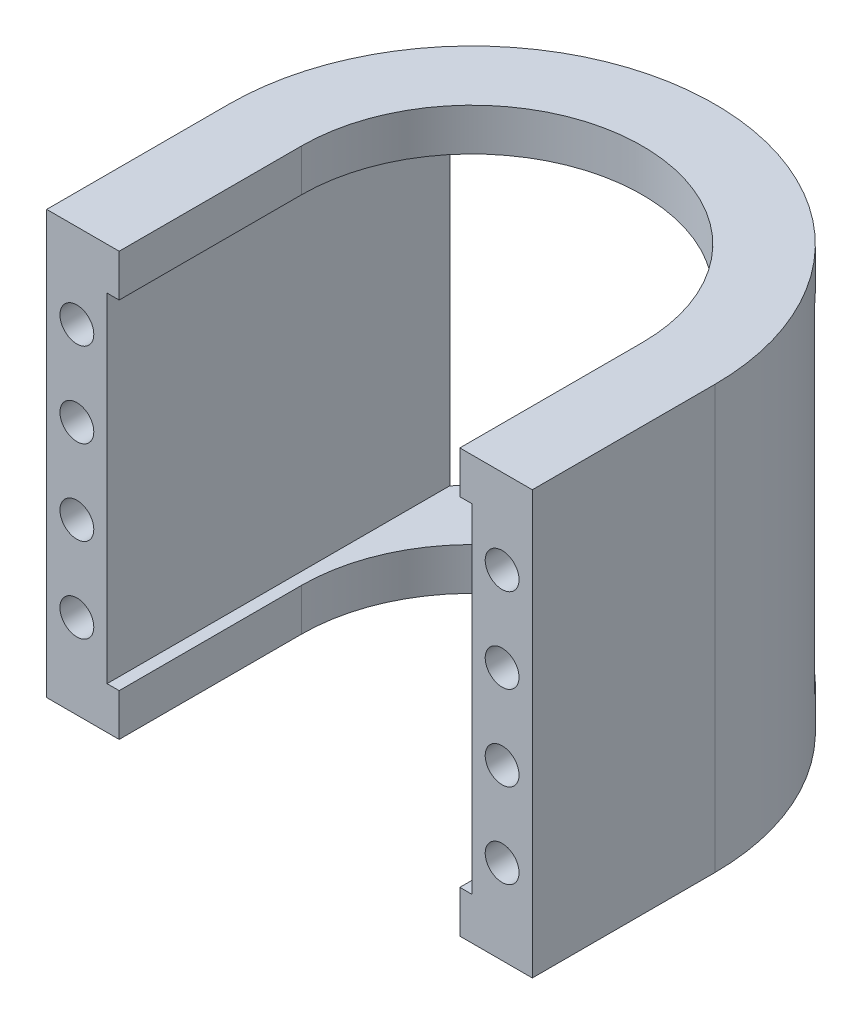
ISO-10303-21;
HEADER;
FILE_DESCRIPTION(('STEP AP214'),'2;1');
FILE_NAME('part.step','',(''),(''),'','','');
FILE_SCHEMA(('AUTOMOTIVE_DESIGN { 1 0 10303 214 1 1 1 1 }'));
ENDSEC;
DATA;
#1=APPLICATION_CONTEXT('core data for automotive mechanical design processes');
#2=APPLICATION_PROTOCOL_DEFINITION('international standard','automotive_design',2000,#1);
#3=PRODUCT_CONTEXT('',#1,'mechanical');
#4=PRODUCT('Part','Part','',(#3));
#5=PRODUCT_RELATED_PRODUCT_CATEGORY('part','',(#4));
#6=PRODUCT_DEFINITION_FORMATION('','',#4);
#7=PRODUCT_DEFINITION_CONTEXT('part definition',#1,'design');
#8=PRODUCT_DEFINITION('design','',#6,#7);
#9=PRODUCT_DEFINITION_SHAPE('','',#8);
#10=(LENGTH_UNIT() NAMED_UNIT(*) SI_UNIT(.MILLI.,.METRE.));
#11=(NAMED_UNIT(*) PLANE_ANGLE_UNIT() SI_UNIT($,.RADIAN.));
#12=(NAMED_UNIT(*) SI_UNIT($,.STERADIAN.) SOLID_ANGLE_UNIT());
#13=UNCERTAINTY_MEASURE_WITH_UNIT(LENGTH_MEASURE(1.E-05),#10,'distance_accuracy_value','');
#14=(GEOMETRIC_REPRESENTATION_CONTEXT(3) GLOBAL_UNCERTAINTY_ASSIGNED_CONTEXT((#13)) GLOBAL_UNIT_ASSIGNED_CONTEXT((#10,
#11,#12)) REPRESENTATION_CONTEXT('',''));
#15=CARTESIAN_POINT('',(0.,0.,0.));
#16=DIRECTION('',(0.,0.,1.));
#17=DIRECTION('',(1.,0.,0.));
#18=AXIS2_PLACEMENT_3D('',#15,#16,#17);
#19=CARTESIAN_POINT('',(-15.1,35.,0.));
#20=DIRECTION('',(-1.,0.,0.));
#21=DIRECTION('',(0.,0.,1.));
#22=AXIS2_PLACEMENT_3D('',#19,#20,#21);
#23=PLANE('',#22);
#24=DIRECTION('',(0.,-1.,0.));
#25=VECTOR('',#24,1.);
#26=CARTESIAN_POINT('',(-15.1,35.,15.1));
#27=LINE('',#26,#25);
#28=CARTESIAN_POINT('',(-15.1,31.5,15.1));
#29=VERTEX_POINT('',#28);
#30=CARTESIAN_POINT('',(-15.1,3.5,15.1));
#31=VERTEX_POINT('',#30);
#32=EDGE_CURVE('E261',#29,#31,#27,.T.);
#33=ORIENTED_EDGE('',*,*,#32,.T.);
#34=DIRECTION('',(0.,0.,1.));
#35=VECTOR('',#34,1.);
#36=CARTESIAN_POINT('',(-15.1,3.5,-20.1));
#37=LINE('',#36,#35);
#38=CARTESIAN_POINT('',(-15.1,3.5,-13.2664991614216));
#39=VERTEX_POINT('',#38);
#40=EDGE_CURVE('E50',#39,#31,#37,.T.);
#41=ORIENTED_EDGE('',*,*,#40,.F.);
#42=DIRECTION('',(0.,-1.,0.));
#43=VECTOR('',#42,1.);
#44=CARTESIAN_POINT('',(-15.1,35.,-13.2664991614216));
#45=LINE('',#44,#43);
#46=CARTESIAN_POINT('',(-15.1,31.5,-13.2664991614216));
#47=VERTEX_POINT('',#46);
#48=EDGE_CURVE('E43',#47,#39,#45,.T.);
#49=ORIENTED_EDGE('',*,*,#48,.F.);
#50=DIRECTION('',(0.,0.,1.));
#51=VECTOR('',#50,1.);
#52=CARTESIAN_POINT('',(-15.1,31.5,-20.1));
#53=LINE('',#52,#51);
#54=EDGE_CURVE('E227',#47,#29,#53,.T.);
#55=ORIENTED_EDGE('',*,*,#54,.T.);
#56=EDGE_LOOP('',(#33,#41,#49,#55));
#57=FACE_BOUND('',#56,.T.);
#58=ADVANCED_FACE('F35',(#57),#23,.F.);
#59=CARTESIAN_POINT('',(15.1,35.,0.));
#60=DIRECTION('',(1.,0.,0.));
#61=DIRECTION('',(0.,0.,-1.));
#62=AXIS2_PLACEMENT_3D('',#59,#60,#61);
#63=PLANE('',#62);
#64=DIRECTION('',(0.,0.,1.));
#65=VECTOR('',#64,1.);
#66=CARTESIAN_POINT('',(15.1,3.5,-20.1));
#67=LINE('',#66,#65);
#68=CARTESIAN_POINT('',(15.1,3.5,-13.2664991614216));
#69=VERTEX_POINT('',#68);
#70=CARTESIAN_POINT('',(15.1,3.5,15.1));
#71=VERTEX_POINT('',#70);
#72=EDGE_CURVE('E58',#69,#71,#67,.T.);
#73=ORIENTED_EDGE('',*,*,#72,.T.);
#74=DIRECTION('',(0.,-1.,0.));
#75=VECTOR('',#74,1.);
#76=CARTESIAN_POINT('',(15.1,35.,15.1));
#77=LINE('',#76,#75);
#78=CARTESIAN_POINT('',(15.1,31.5,15.1));
#79=VERTEX_POINT('',#78);
#80=EDGE_CURVE('E259',#79,#71,#77,.T.);
#81=ORIENTED_EDGE('',*,*,#80,.F.);
#82=DIRECTION('',(0.,0.,1.));
#83=VECTOR('',#82,1.);
#84=CARTESIAN_POINT('',(15.1,31.5,-20.1));
#85=LINE('',#84,#83);
#86=CARTESIAN_POINT('',(15.1,31.5,-13.2664991614216));
#87=VERTEX_POINT('',#86);
#88=EDGE_CURVE('E230',#87,#79,#85,.T.);
#89=ORIENTED_EDGE('',*,*,#88,.F.);
#90=DIRECTION('',(0.,-1.,0.));
#91=VECTOR('',#90,1.);
#92=CARTESIAN_POINT('',(15.1,35.,-13.2664991614216));
#93=LINE('',#92,#91);
#94=EDGE_CURVE('E11',#69,#87,#93,.F.);
#95=ORIENTED_EDGE('',*,*,#94,.F.);
#96=EDGE_LOOP('',(#73,#81,#89,#95));
#97=FACE_BOUND('',#96,.T.);
#98=ADVANCED_FACE('F384',(#97),#63,.F.);
#99=CARTESIAN_POINT('',(-20.1,35.,0.));
#100=DIRECTION('',(1.,0.,0.));
#101=DIRECTION('',(0.,0.,-1.));
#102=AXIS2_PLACEMENT_3D('',#99,#100,#101);
#103=PLANE('',#102);
#104=DIRECTION('',(0.,0.,1.));
#105=VECTOR('',#104,1.);
#106=CARTESIAN_POINT('',(-20.1,0.,0.));
#107=LINE('',#106,#105);
#108=CARTESIAN_POINT('',(-20.1,0.,0.));
#109=VERTEX_POINT('',#108);
#110=CARTESIAN_POINT('',(-20.1,0.,15.1));
#111=VERTEX_POINT('',#110);
#112=EDGE_CURVE('E229',#109,#111,#107,.T.);
#113=ORIENTED_EDGE('',*,*,#112,.T.);
#114=DIRECTION('',(0.,-1.,0.));
#115=VECTOR('',#114,1.);
#116=CARTESIAN_POINT('',(-20.1,35.,15.1));
#117=LINE('',#116,#115);
#118=CARTESIAN_POINT('',(-20.1,35.,15.1));
#119=VERTEX_POINT('',#118);
#120=EDGE_CURVE('E263',#119,#111,#117,.T.);
#121=ORIENTED_EDGE('',*,*,#120,.F.);
#122=DIRECTION('',(0.,0.,1.));
#123=VECTOR('',#122,1.);
#124=CARTESIAN_POINT('',(-20.1,35.,0.));
#125=LINE('',#124,#123);
#126=CARTESIAN_POINT('',(-20.1,35.,0.));
#127=VERTEX_POINT('',#126);
#128=EDGE_CURVE('E234',#127,#119,#125,.T.);
#129=ORIENTED_EDGE('',*,*,#128,.F.);
#130=DIRECTION('',(0.,-1.,0.));
#131=VECTOR('',#130,1.);
#132=CARTESIAN_POINT('',(-20.1,35.,0.));
#133=LINE('',#132,#131);
#134=EDGE_CURVE('E246',#127,#109,#133,.T.);
#135=ORIENTED_EDGE('',*,*,#134,.T.);
#136=EDGE_LOOP('',(#113,#121,#129,#135));
#137=FACE_BOUND('',#136,.T.);
#138=ADVANCED_FACE('F37',(#137),#103,.F.);
#139=CARTESIAN_POINT('',(-15.1,35.,15.1));
#140=DIRECTION('',(0.,0.,-1.));
#141=DIRECTION('',(-1.,0.,0.));
#142=AXIS2_PLACEMENT_3D('',#139,#140,#141);
#143=PLANE('',#142);
#144=CARTESIAN_POINT('',(-17.5999999999998,7.,15.1));
#145=DIRECTION('',(0.,0.,1.));
#146=DIRECTION('',(1.,0.,0.));
#147=AXIS2_PLACEMENT_3D('',#144,#145,#146);
#148=CIRCLE('',#147,1.4);
#149=CARTESIAN_POINT('',(-16.1999999999998,7.,15.1));
#150=VERTEX_POINT('',#149);
#151=EDGE_CURVE('E318',#150,#150,#148,.T.);
#152=ORIENTED_EDGE('',*,*,#151,.F.);
#153=EDGE_LOOP('',(#152));
#154=FACE_BOUND('',#153,.T.);
#155=CARTESIAN_POINT('',(-17.5999999999998,14.,15.1));
#156=DIRECTION('',(0.,0.,1.));
#157=DIRECTION('',(1.,0.,0.));
#158=AXIS2_PLACEMENT_3D('',#155,#156,#157);
#159=CIRCLE('',#158,1.4);
#160=CARTESIAN_POINT('',(-16.1999999999998,14.,15.1));
#161=VERTEX_POINT('',#160);
#162=EDGE_CURVE('E317',#161,#161,#159,.T.);
#163=ORIENTED_EDGE('',*,*,#162,.F.);
#164=EDGE_LOOP('',(#163));
#165=FACE_BOUND('',#164,.T.);
#166=CARTESIAN_POINT('',(-17.5999999999999,21.,15.1));
#167=DIRECTION('',(0.,0.,1.));
#168=DIRECTION('',(1.,0.,0.));
#169=AXIS2_PLACEMENT_3D('',#166,#167,#168);
#170=CIRCLE('',#169,1.4);
#171=CARTESIAN_POINT('',(-16.1999999999999,21.,15.1));
#172=VERTEX_POINT('',#171);
#173=EDGE_CURVE('E312',#172,#172,#170,.T.);
#174=ORIENTED_EDGE('',*,*,#173,.F.);
#175=EDGE_LOOP('',(#174));
#176=FACE_BOUND('',#175,.T.);
#177=CARTESIAN_POINT('',(-17.6,28.,15.1));
#178=DIRECTION('',(0.,0.,1.));
#179=DIRECTION('',(1.,0.,0.));
#180=AXIS2_PLACEMENT_3D('',#177,#178,#179);
#181=CIRCLE('',#180,1.4);
#182=CARTESIAN_POINT('',(-16.2,28.,15.1));
#183=VERTEX_POINT('',#182);
#184=EDGE_CURVE('E183',#183,#183,#181,.T.);
#185=ORIENTED_EDGE('',*,*,#184,.F.);
#186=EDGE_LOOP('',(#185));
#187=FACE_BOUND('',#186,.T.);
#188=DIRECTION('',(1.,0.,0.));
#189=VECTOR('',#188,1.);
#190=CARTESIAN_POINT('',(-15.1,0.,15.1));
#191=LINE('',#190,#189);
#192=CARTESIAN_POINT('',(-14.1,0.,15.1));
#193=VERTEX_POINT('',#192);
#194=EDGE_CURVE('E162',#111,#193,#191,.T.);
#195=ORIENTED_EDGE('',*,*,#194,.T.);
#196=DIRECTION('',(0.,-1.,0.));
#197=VECTOR('',#196,1.);
#198=CARTESIAN_POINT('',(-14.1,46.2092495836675,15.1));
#199=LINE('',#198,#197);
#200=CARTESIAN_POINT('',(-14.1,3.5,15.1));
#201=VERTEX_POINT('',#200);
#202=EDGE_CURVE('E191',#201,#193,#199,.T.);
#203=ORIENTED_EDGE('',*,*,#202,.F.);
#204=DIRECTION('',(1.,0.,0.));
#205=VECTOR('',#204,1.);
#206=CARTESIAN_POINT('',(-15.1,3.5,15.1));
#207=LINE('',#206,#205);
#208=EDGE_CURVE('E186',#31,#201,#207,.T.);
#209=ORIENTED_EDGE('',*,*,#208,.F.);
#210=ORIENTED_EDGE('',*,*,#32,.F.);
#211=DIRECTION('',(-1.,0.,0.));
#212=VECTOR('',#211,1.);
#213=CARTESIAN_POINT('',(-14.1,31.5,15.1));
#214=LINE('',#213,#212);
#215=CARTESIAN_POINT('',(-14.1,31.5,15.1));
#216=VERTEX_POINT('',#215);
#217=EDGE_CURVE('E197',#216,#29,#214,.T.);
#218=ORIENTED_EDGE('',*,*,#217,.F.);
#219=DIRECTION('',(0.,1.,0.));
#220=VECTOR('',#219,1.);
#221=CARTESIAN_POINT('',(-14.1,-11.2092495836675,15.1));
#222=LINE('',#221,#220);
#223=CARTESIAN_POINT('',(-14.1,35.,15.1));
#224=VERTEX_POINT('',#223);
#225=EDGE_CURVE('E218',#216,#224,#222,.T.);
#226=ORIENTED_EDGE('',*,*,#225,.T.);
#227=DIRECTION('',(1.,0.,0.));
#228=VECTOR('',#227,1.);
#229=CARTESIAN_POINT('',(-15.1,35.,15.1));
#230=LINE('',#229,#228);
#231=EDGE_CURVE('E237',#119,#224,#230,.T.);
#232=ORIENTED_EDGE('',*,*,#231,.F.);
#233=ORIENTED_EDGE('',*,*,#120,.T.);
#234=EDGE_LOOP('',(#195,#203,#209,#210,#218,#226,#232,#233));
#235=FACE_BOUND('',#234,.T.);
#236=ADVANCED_FACE('F284',(#154,#165,#176,#187,#235),#143,.F.);
#237=CARTESIAN_POINT('',(15.1,35.,15.1));
#238=DIRECTION('',(0.,0.,-1.));
#239=DIRECTION('',(-1.,0.,0.));
#240=AXIS2_PLACEMENT_3D('',#237,#238,#239);
#241=PLANE('',#240);
#242=CARTESIAN_POINT('',(17.6,28.,15.1));
#243=DIRECTION('',(0.,0.,1.));
#244=DIRECTION('',(1.,0.,0.));
#245=AXIS2_PLACEMENT_3D('',#242,#243,#244);
#246=CIRCLE('',#245,1.4);
#247=CARTESIAN_POINT('',(19.,28.,15.1));
#248=VERTEX_POINT('',#247);
#249=EDGE_CURVE('E329',#248,#248,#246,.T.);
#250=ORIENTED_EDGE('',*,*,#249,.F.);
#251=EDGE_LOOP('',(#250));
#252=FACE_BOUND('',#251,.T.);
#253=CARTESIAN_POINT('',(17.6000000000001,21.,15.1));
#254=DIRECTION('',(0.,0.,1.));
#255=DIRECTION('',(1.,0.,0.));
#256=AXIS2_PLACEMENT_3D('',#253,#254,#255);
#257=CIRCLE('',#256,1.4);
#258=CARTESIAN_POINT('',(19.0000000000001,21.,15.1));
#259=VERTEX_POINT('',#258);
#260=EDGE_CURVE('E330',#259,#259,#257,.T.);
#261=ORIENTED_EDGE('',*,*,#260,.F.);
#262=EDGE_LOOP('',(#261));
#263=FACE_BOUND('',#262,.T.);
#264=CARTESIAN_POINT('',(17.6000000000002,14.,15.1));
#265=DIRECTION('',(0.,0.,1.));
#266=DIRECTION('',(1.,0.,0.));
#267=AXIS2_PLACEMENT_3D('',#264,#265,#266);
#268=CIRCLE('',#267,1.4);
#269=CARTESIAN_POINT('',(19.0000000000002,14.,15.1));
#270=VERTEX_POINT('',#269);
#271=EDGE_CURVE('E347',#270,#270,#268,.T.);
#272=ORIENTED_EDGE('',*,*,#271,.F.);
#273=EDGE_LOOP('',(#272));
#274=FACE_BOUND('',#273,.T.);
#275=CARTESIAN_POINT('',(17.6000000000002,7.,15.1));
#276=DIRECTION('',(0.,0.,1.));
#277=DIRECTION('',(1.,0.,0.));
#278=AXIS2_PLACEMENT_3D('',#275,#276,#277);
#279=CIRCLE('',#278,1.4);
#280=CARTESIAN_POINT('',(19.0000000000002,7.,15.1));
#281=VERTEX_POINT('',#280);
#282=EDGE_CURVE('E341',#281,#281,#279,.T.);
#283=ORIENTED_EDGE('',*,*,#282,.F.);
#284=EDGE_LOOP('',(#283));
#285=FACE_BOUND('',#284,.T.);
#286=DIRECTION('',(1.,0.,0.));
#287=VECTOR('',#286,1.);
#288=CARTESIAN_POINT('',(15.1,0.,15.1));
#289=LINE('',#288,#287);
#290=CARTESIAN_POINT('',(14.1,0.,15.1));
#291=VERTEX_POINT('',#290);
#292=CARTESIAN_POINT('',(20.1,0.,15.1));
#293=VERTEX_POINT('',#292);
#294=EDGE_CURVE('E150',#291,#293,#289,.T.);
#295=ORIENTED_EDGE('',*,*,#294,.T.);
#296=DIRECTION('',(0.,-1.,0.));
#297=VECTOR('',#296,1.);
#298=CARTESIAN_POINT('',(20.1,35.,15.1));
#299=LINE('',#298,#297);
#300=CARTESIAN_POINT('',(20.1,35.,15.1));
#301=VERTEX_POINT('',#300);
#302=EDGE_CURVE('E257',#301,#293,#299,.T.);
#303=ORIENTED_EDGE('',*,*,#302,.F.);
#304=DIRECTION('',(1.,0.,0.));
#305=VECTOR('',#304,1.);
#306=CARTESIAN_POINT('',(15.1,35.,15.1));
#307=LINE('',#306,#305);
#308=CARTESIAN_POINT('',(14.1,35.,15.1));
#309=VERTEX_POINT('',#308);
#310=EDGE_CURVE('E240',#309,#301,#307,.T.);
#311=ORIENTED_EDGE('',*,*,#310,.F.);
#312=DIRECTION('',(0.,1.,0.));
#313=VECTOR('',#312,1.);
#314=CARTESIAN_POINT('',(14.1,-11.2092495836675,15.1));
#315=LINE('',#314,#313);
#316=CARTESIAN_POINT('',(14.1,31.5,15.1));
#317=VERTEX_POINT('',#316);
#318=EDGE_CURVE('E201',#317,#309,#315,.T.);
#319=ORIENTED_EDGE('',*,*,#318,.F.);
#320=DIRECTION('',(-1.,0.,0.));
#321=VECTOR('',#320,1.);
#322=CARTESIAN_POINT('',(14.1,31.5,15.1));
#323=LINE('',#322,#321);
#324=EDGE_CURVE('E207',#79,#317,#323,.T.);
#325=ORIENTED_EDGE('',*,*,#324,.F.);
#326=ORIENTED_EDGE('',*,*,#80,.T.);
#327=DIRECTION('',(1.,0.,0.));
#328=VECTOR('',#327,1.);
#329=CARTESIAN_POINT('',(14.1,3.5,15.1));
#330=LINE('',#329,#328);
#331=CARTESIAN_POINT('',(14.1,3.5,15.1));
#332=VERTEX_POINT('',#331);
#333=EDGE_CURVE('E169',#332,#71,#330,.T.);
#334=ORIENTED_EDGE('',*,*,#333,.F.);
#335=DIRECTION('',(0.,-1.,0.));
#336=VECTOR('',#335,1.);
#337=CARTESIAN_POINT('',(14.1,46.2092495836675,15.1));
#338=LINE('',#337,#336);
#339=EDGE_CURVE('E166',#332,#291,#338,.T.);
#340=ORIENTED_EDGE('',*,*,#339,.T.);
#341=EDGE_LOOP('',(#295,#303,#311,#319,#325,#326,#334,#340));
#342=FACE_BOUND('',#341,.T.);
#343=ADVANCED_FACE('F167',(#252,#263,#274,#285,#342),#241,.F.);
#344=CARTESIAN_POINT('',(20.1,35.,0.));
#345=DIRECTION('',(-1.,0.,0.));
#346=DIRECTION('',(0.,0.,1.));
#347=AXIS2_PLACEMENT_3D('',#344,#345,#346);
#348=PLANE('',#347);
#349=DIRECTION('',(0.,0.,-1.));
#350=VECTOR('',#349,1.);
#351=CARTESIAN_POINT('',(20.1,0.,0.));
#352=LINE('',#351,#350);
#353=CARTESIAN_POINT('',(20.1,0.,0.));
#354=VERTEX_POINT('',#353);
#355=EDGE_CURVE('E158',#293,#354,#352,.T.);
#356=ORIENTED_EDGE('',*,*,#355,.T.);
#357=DIRECTION('',(0.,-1.,0.));
#358=VECTOR('',#357,1.);
#359=CARTESIAN_POINT('',(20.1,35.,0.));
#360=LINE('',#359,#358);
#361=CARTESIAN_POINT('',(20.1,35.,0.));
#362=VERTEX_POINT('',#361);
#363=EDGE_CURVE('E254',#362,#354,#360,.T.);
#364=ORIENTED_EDGE('',*,*,#363,.F.);
#365=DIRECTION('',(0.,0.,-1.));
#366=VECTOR('',#365,1.);
#367=CARTESIAN_POINT('',(20.1,35.,0.));
#368=LINE('',#367,#366);
#369=EDGE_CURVE('E242',#301,#362,#368,.T.);
#370=ORIENTED_EDGE('',*,*,#369,.F.);
#371=ORIENTED_EDGE('',*,*,#302,.T.);
#372=EDGE_LOOP('',(#356,#364,#370,#371));
#373=FACE_BOUND('',#372,.T.);
#374=ADVANCED_FACE('F360',(#373),#348,.F.);
#375=CARTESIAN_POINT('',(0.,35.,0.));
#376=DIRECTION('',(0.,-1.,0.));
#377=DIRECTION('',(0.,0.,-1.));
#378=AXIS2_PLACEMENT_3D('',#375,#376,#377);
#379=CYLINDRICAL_SURFACE('',#378,20.1);
#380=ORIENTED_EDGE('',*,*,#94,.T.);
#381=CARTESIAN_POINT('',(0.,31.5,0.));
#382=DIRECTION('',(0.,1.,0.));
#383=DIRECTION('',(0.,0.,1.));
#384=AXIS2_PLACEMENT_3D('',#381,#382,#383);
#385=CIRCLE('',#384,20.1);
#386=EDGE_CURVE('E268',#87,#47,#385,.T.);
#387=ORIENTED_EDGE('',*,*,#386,.T.);
#388=ORIENTED_EDGE('',*,*,#48,.T.);
#389=CARTESIAN_POINT('',(0.,3.5,0.));
#390=DIRECTION('',(0.,-1.,0.));
#391=DIRECTION('',(0.,0.,-1.));
#392=AXIS2_PLACEMENT_3D('',#389,#390,#391);
#393=CIRCLE('',#392,20.1);
#394=EDGE_CURVE('E266',#39,#69,#393,.T.);
#395=ORIENTED_EDGE('',*,*,#394,.T.);
#396=EDGE_LOOP('',(#380,#387,#388,#395));
#397=FACE_BOUND('',#396,.T.);
#398=CARTESIAN_POINT('',(0.,0.,0.));
#399=DIRECTION('',(0.,1.,0.));
#400=DIRECTION('',(0.,0.,1.));
#401=AXIS2_PLACEMENT_3D('',#398,#399,#400);
#402=CIRCLE('',#401,20.1);
#403=EDGE_CURVE('E238',#354,#109,#402,.T.);
#404=ORIENTED_EDGE('',*,*,#403,.T.);
#405=ORIENTED_EDGE('',*,*,#134,.F.);
#406=CARTESIAN_POINT('',(0.,35.,0.));
#407=DIRECTION('',(0.,1.,0.));
#408=DIRECTION('',(0.,0.,1.));
#409=AXIS2_PLACEMENT_3D('',#406,#407,#408);
#410=CIRCLE('',#409,20.1);
#411=EDGE_CURVE('E244',#362,#127,#410,.T.);
#412=ORIENTED_EDGE('',*,*,#411,.F.);
#413=ORIENTED_EDGE('',*,*,#363,.T.);
#414=EDGE_LOOP('',(#404,#405,#412,#413));
#415=FACE_BOUND('',#414,.T.);
#416=ADVANCED_FACE('F272',(#397,#415),#379,.T.);
#417=CARTESIAN_POINT('',(0.,35.,0.));
#418=DIRECTION('',(0.,1.,0.));
#419=DIRECTION('',(0.,0.,1.));
#420=AXIS2_PLACEMENT_3D('',#417,#418,#419);
#421=PLANE('',#420);
#422=DIRECTION('',(0.,0.,1.));
#423=VECTOR('',#422,1.);
#424=CARTESIAN_POINT('',(14.1,35.,0.));
#425=LINE('',#424,#423);
#426=CARTESIAN_POINT('',(14.1,35.,0.));
#427=VERTEX_POINT('',#426);
#428=EDGE_CURVE('E215',#427,#309,#425,.T.);
#429=ORIENTED_EDGE('',*,*,#428,.T.);
#430=ORIENTED_EDGE('',*,*,#310,.T.);
#431=ORIENTED_EDGE('',*,*,#369,.T.);
#432=ORIENTED_EDGE('',*,*,#411,.T.);
#433=ORIENTED_EDGE('',*,*,#128,.T.);
#434=ORIENTED_EDGE('',*,*,#231,.T.);
#435=DIRECTION('',(0.,0.,-1.));
#436=VECTOR('',#435,1.);
#437=CARTESIAN_POINT('',(-14.1,35.,0.));
#438=LINE('',#437,#436);
#439=CARTESIAN_POINT('',(-14.1,35.,0.));
#440=VERTEX_POINT('',#439);
#441=EDGE_CURVE('E209',#224,#440,#438,.T.);
#442=ORIENTED_EDGE('',*,*,#441,.T.);
#443=CARTESIAN_POINT('',(0.,35.,0.));
#444=DIRECTION('',(0.,-1.,0.));
#445=DIRECTION('',(0.,0.,-1.));
#446=AXIS2_PLACEMENT_3D('',#443,#444,#445);
#447=CIRCLE('',#446,14.1);
#448=EDGE_CURVE('E212',#440,#427,#447,.T.);
#449=ORIENTED_EDGE('',*,*,#448,.T.);
#450=EDGE_LOOP('',(#429,#430,#431,#432,#433,#434,#442,#449));
#451=FACE_BOUND('',#450,.T.);
#452=ADVANCED_FACE('F292',(#451),#421,.T.);
#453=CARTESIAN_POINT('',(0.,0.,0.));
#454=DIRECTION('',(0.,1.,0.));
#455=DIRECTION('',(0.,0.,1.));
#456=AXIS2_PLACEMENT_3D('',#453,#454,#455);
#457=PLANE('',#456);
#458=ORIENTED_EDGE('',*,*,#112,.F.);
#459=ORIENTED_EDGE('',*,*,#403,.F.);
#460=ORIENTED_EDGE('',*,*,#355,.F.);
#461=ORIENTED_EDGE('',*,*,#294,.F.);
#462=DIRECTION('',(0.,0.,-1.));
#463=VECTOR('',#462,1.);
#464=CARTESIAN_POINT('',(14.1,0.,0.));
#465=LINE('',#464,#463);
#466=CARTESIAN_POINT('',(14.1,0.,0.));
#467=VERTEX_POINT('',#466);
#468=EDGE_CURVE('E156',#291,#467,#465,.T.);
#469=ORIENTED_EDGE('',*,*,#468,.T.);
#470=CARTESIAN_POINT('',(0.,0.,0.));
#471=DIRECTION('',(0.,1.,0.));
#472=DIRECTION('',(0.,0.,-1.));
#473=AXIS2_PLACEMENT_3D('',#470,#471,#472);
#474=CIRCLE('',#473,14.1);
#475=CARTESIAN_POINT('',(-14.1,0.,0.));
#476=VERTEX_POINT('',#475);
#477=EDGE_CURVE('E178',#467,#476,#474,.T.);
#478=ORIENTED_EDGE('',*,*,#477,.T.);
#479=DIRECTION('',(0.,0.,1.));
#480=VECTOR('',#479,1.);
#481=CARTESIAN_POINT('',(-14.1,0.,15.1));
#482=LINE('',#481,#480);
#483=EDGE_CURVE('E173',#476,#193,#482,.T.);
#484=ORIENTED_EDGE('',*,*,#483,.T.);
#485=ORIENTED_EDGE('',*,*,#194,.F.);
#486=EDGE_LOOP('',(#458,#459,#460,#461,#469,#478,#484,#485));
#487=FACE_BOUND('',#486,.T.);
#488=ADVANCED_FACE('F153',(#487),#457,.F.);
#489=CARTESIAN_POINT('',(-15.1,31.5,-20.1));
#490=DIRECTION('',(0.,1.,0.));
#491=DIRECTION('',(0.,0.,1.));
#492=AXIS2_PLACEMENT_3D('',#489,#490,#491);
#493=PLANE('',#492);
#494=ORIENTED_EDGE('',*,*,#54,.F.);
#495=ORIENTED_EDGE('',*,*,#386,.F.);
#496=ORIENTED_EDGE('',*,*,#88,.T.);
#497=ORIENTED_EDGE('',*,*,#324,.T.);
#498=DIRECTION('',(0.,0.,-1.));
#499=VECTOR('',#498,1.);
#500=CARTESIAN_POINT('',(14.1,31.5,0.));
#501=LINE('',#500,#499);
#502=CARTESIAN_POINT('',(14.1,31.5,0.));
#503=VERTEX_POINT('',#502);
#504=EDGE_CURVE('E205',#317,#503,#501,.T.);
#505=ORIENTED_EDGE('',*,*,#504,.T.);
#506=CARTESIAN_POINT('',(0.,31.5,0.));
#507=DIRECTION('',(0.,1.,0.));
#508=DIRECTION('',(0.,0.,1.));
#509=AXIS2_PLACEMENT_3D('',#506,#507,#508);
#510=CIRCLE('',#509,14.1);
#511=CARTESIAN_POINT('',(-14.1,31.5,0.));
#512=VERTEX_POINT('',#511);
#513=EDGE_CURVE('E203',#503,#512,#510,.T.);
#514=ORIENTED_EDGE('',*,*,#513,.T.);
#515=DIRECTION('',(0.,0.,1.));
#516=VECTOR('',#515,1.);
#517=CARTESIAN_POINT('',(-14.1,31.5,0.));
#518=LINE('',#517,#516);
#519=EDGE_CURVE('E200',#512,#216,#518,.T.);
#520=ORIENTED_EDGE('',*,*,#519,.T.);
#521=ORIENTED_EDGE('',*,*,#217,.T.);
#522=EDGE_LOOP('',(#494,#495,#496,#497,#505,#514,#520,#521));
#523=FACE_BOUND('',#522,.T.);
#524=ADVANCED_FACE('F278',(#523),#493,.F.);
#525=CARTESIAN_POINT('',(-15.1,3.5,-20.1));
#526=DIRECTION('',(0.,-1.,0.));
#527=DIRECTION('',(0.,0.,-1.));
#528=AXIS2_PLACEMENT_3D('',#525,#526,#527);
#529=PLANE('',#528);
#530=ORIENTED_EDGE('',*,*,#72,.F.);
#531=ORIENTED_EDGE('',*,*,#394,.F.);
#532=ORIENTED_EDGE('',*,*,#40,.T.);
#533=ORIENTED_EDGE('',*,*,#208,.T.);
#534=DIRECTION('',(0.,0.,-1.));
#535=VECTOR('',#534,1.);
#536=CARTESIAN_POINT('',(-14.1,3.5,15.1));
#537=LINE('',#536,#535);
#538=CARTESIAN_POINT('',(-14.1,3.5,0.));
#539=VERTEX_POINT('',#538);
#540=EDGE_CURVE('E303',#201,#539,#537,.T.);
#541=ORIENTED_EDGE('',*,*,#540,.T.);
#542=CARTESIAN_POINT('',(0.,3.5,0.));
#543=DIRECTION('',(0.,-1.,0.));
#544=DIRECTION('',(0.,0.,-1.));
#545=AXIS2_PLACEMENT_3D('',#542,#543,#544);
#546=CIRCLE('',#545,14.1);
#547=CARTESIAN_POINT('',(14.1,3.5,0.));
#548=VERTEX_POINT('',#547);
#549=EDGE_CURVE('E304',#539,#548,#546,.T.);
#550=ORIENTED_EDGE('',*,*,#549,.T.);
#551=DIRECTION('',(0.,0.,1.));
#552=VECTOR('',#551,1.);
#553=CARTESIAN_POINT('',(14.1,3.5,0.));
#554=LINE('',#553,#552);
#555=EDGE_CURVE('E306',#548,#332,#554,.T.);
#556=ORIENTED_EDGE('',*,*,#555,.T.);
#557=ORIENTED_EDGE('',*,*,#333,.T.);
#558=EDGE_LOOP('',(#530,#531,#532,#533,#541,#550,#556,#557));
#559=FACE_BOUND('',#558,.T.);
#560=ADVANCED_FACE('F431',(#559),#529,.F.);
#561=CARTESIAN_POINT('',(14.1,-11.2092495836675,0.));
#562=DIRECTION('',(-1.,0.,0.));
#563=DIRECTION('',(0.,0.,1.));
#564=AXIS2_PLACEMENT_3D('',#561,#562,#563);
#565=PLANE('',#564);
#566=ORIENTED_EDGE('',*,*,#504,.F.);
#567=ORIENTED_EDGE('',*,*,#318,.T.);
#568=ORIENTED_EDGE('',*,*,#428,.F.);
#569=DIRECTION('',(0.,1.,0.));
#570=VECTOR('',#569,1.);
#571=CARTESIAN_POINT('',(14.1,-11.2092495836675,0.));
#572=LINE('',#571,#570);
#573=EDGE_CURVE('E221',#503,#427,#572,.T.);
#574=ORIENTED_EDGE('',*,*,#573,.F.);
#575=EDGE_LOOP('',(#566,#567,#568,#574));
#576=FACE_BOUND('',#575,.T.);
#577=ADVANCED_FACE('F427',(#576),#565,.T.);
#578=CARTESIAN_POINT('',(0.,-11.2092495836675,0.));
#579=DIRECTION('',(0.,1.,0.));
#580=DIRECTION('',(0.,0.,1.));
#581=AXIS2_PLACEMENT_3D('',#578,#579,#580);
#582=CYLINDRICAL_SURFACE('',#581,14.1);
#583=ORIENTED_EDGE('',*,*,#513,.F.);
#584=ORIENTED_EDGE('',*,*,#573,.T.);
#585=ORIENTED_EDGE('',*,*,#448,.F.);
#586=DIRECTION('',(0.,1.,0.));
#587=VECTOR('',#586,1.);
#588=CARTESIAN_POINT('',(-14.1,-11.2092495836675,0.));
#589=LINE('',#588,#587);
#590=EDGE_CURVE('E223',#512,#440,#589,.T.);
#591=ORIENTED_EDGE('',*,*,#590,.F.);
#592=EDGE_LOOP('',(#583,#584,#585,#591));
#593=FACE_BOUND('',#592,.T.);
#594=ADVANCED_FACE('F430',(#593),#582,.F.);
#595=CARTESIAN_POINT('',(-14.1,-11.2092495836675,0.));
#596=DIRECTION('',(1.,0.,0.));
#597=DIRECTION('',(0.,0.,-1.));
#598=AXIS2_PLACEMENT_3D('',#595,#596,#597);
#599=PLANE('',#598);
#600=ORIENTED_EDGE('',*,*,#519,.F.);
#601=ORIENTED_EDGE('',*,*,#590,.T.);
#602=ORIENTED_EDGE('',*,*,#441,.F.);
#603=ORIENTED_EDGE('',*,*,#225,.F.);
#604=EDGE_LOOP('',(#600,#601,#602,#603));
#605=FACE_BOUND('',#604,.T.);
#606=ADVANCED_FACE('F288',(#605),#599,.T.);
#607=CARTESIAN_POINT('',(-14.1,46.2092495836675,15.1));
#608=DIRECTION('',(1.,0.,0.));
#609=DIRECTION('',(0.,0.,-1.));
#610=AXIS2_PLACEMENT_3D('',#607,#608,#609);
#611=PLANE('',#610);
#612=ORIENTED_EDGE('',*,*,#540,.F.);
#613=ORIENTED_EDGE('',*,*,#202,.T.);
#614=ORIENTED_EDGE('',*,*,#483,.F.);
#615=DIRECTION('',(0.,-1.,0.));
#616=VECTOR('',#615,1.);
#617=CARTESIAN_POINT('',(-14.1,46.2092495836675,0.));
#618=LINE('',#617,#616);
#619=EDGE_CURVE('E194',#539,#476,#618,.T.);
#620=ORIENTED_EDGE('',*,*,#619,.F.);
#621=EDGE_LOOP('',(#612,#613,#614,#620));
#622=FACE_BOUND('',#621,.T.);
#623=ADVANCED_FACE('F302',(#622),#611,.T.);
#624=CARTESIAN_POINT('',(0.,46.2092495836675,0.));
#625=DIRECTION('',(0.,-1.,0.));
#626=DIRECTION('',(0.,0.,-1.));
#627=AXIS2_PLACEMENT_3D('',#624,#625,#626);
#628=CYLINDRICAL_SURFACE('',#627,14.1);
#629=ORIENTED_EDGE('',*,*,#549,.F.);
#630=ORIENTED_EDGE('',*,*,#619,.T.);
#631=ORIENTED_EDGE('',*,*,#477,.F.);
#632=DIRECTION('',(0.,-1.,0.));
#633=VECTOR('',#632,1.);
#634=CARTESIAN_POINT('',(14.1,46.2092495836675,0.));
#635=LINE('',#634,#633);
#636=EDGE_CURVE('E172',#548,#467,#635,.T.);
#637=ORIENTED_EDGE('',*,*,#636,.F.);
#638=EDGE_LOOP('',(#629,#630,#631,#637));
#639=FACE_BOUND('',#638,.T.);
#640=ADVANCED_FACE('F379',(#639),#628,.F.);
#641=CARTESIAN_POINT('',(14.1,46.2092495836675,0.));
#642=DIRECTION('',(-1.,0.,0.));
#643=DIRECTION('',(0.,0.,1.));
#644=AXIS2_PLACEMENT_3D('',#641,#642,#643);
#645=PLANE('',#644);
#646=ORIENTED_EDGE('',*,*,#555,.F.);
#647=ORIENTED_EDGE('',*,*,#636,.T.);
#648=ORIENTED_EDGE('',*,*,#468,.F.);
#649=ORIENTED_EDGE('',*,*,#339,.F.);
#650=EDGE_LOOP('',(#646,#647,#648,#649));
#651=FACE_BOUND('',#650,.T.);
#652=ADVANCED_FACE('F175',(#651),#645,.T.);
#653=CARTESIAN_POINT('',(17.6000000000002,7.,5.1));
#654=DIRECTION('',(0.,0.,1.));
#655=DIRECTION('',(1.,0.,0.));
#656=AXIS2_PLACEMENT_3D('',#653,#654,#655);
#657=CYLINDRICAL_SURFACE('',#656,1.4);
#658=CARTESIAN_POINT('',(17.6000000000002,7.,5.1));
#659=DIRECTION('',(0.,0.,1.));
#660=DIRECTION('',(1.,0.,0.));
#661=AXIS2_PLACEMENT_3D('',#658,#659,#660);
#662=CIRCLE('',#661,1.4);
#663=CARTESIAN_POINT('',(19.0000000000002,7.,5.1));
#664=VERTEX_POINT('',#663);
#665=EDGE_CURVE('E338',#664,#664,#662,.T.);
#666=ORIENTED_EDGE('',*,*,#665,.F.);
#667=EDGE_LOOP('',(#666));
#668=FACE_BOUND('',#667,.T.);
#669=ORIENTED_EDGE('',*,*,#282,.T.);
#670=EDGE_LOOP('',(#669));
#671=FACE_BOUND('',#670,.T.);
#672=ADVANCED_FACE('F367',(#668,#671),#657,.F.);
#673=CARTESIAN_POINT('',(17.6000000000002,7.,5.1));
#674=DIRECTION('',(0.,0.,1.));
#675=DIRECTION('',(1.,0.,0.));
#676=AXIS2_PLACEMENT_3D('',#673,#674,#675);
#677=PLANE('',#676);
#678=ORIENTED_EDGE('',*,*,#665,.T.);
#679=EDGE_LOOP('',(#678));
#680=FACE_BOUND('',#679,.T.);
#681=ADVANCED_FACE('F369',(#680),#677,.T.);
#682=CARTESIAN_POINT('',(17.6000000000002,14.,5.1));
#683=DIRECTION('',(0.,0.,1.));
#684=DIRECTION('',(1.,0.,0.));
#685=AXIS2_PLACEMENT_3D('',#682,#683,#684);
#686=CYLINDRICAL_SURFACE('',#685,1.4);
#687=CARTESIAN_POINT('',(17.6000000000002,14.,5.1));
#688=DIRECTION('',(0.,0.,1.));
#689=DIRECTION('',(1.,0.,0.));
#690=AXIS2_PLACEMENT_3D('',#687,#688,#689);
#691=CIRCLE('',#690,1.4);
#692=CARTESIAN_POINT('',(19.0000000000002,14.,5.1));
#693=VERTEX_POINT('',#692);
#694=EDGE_CURVE('E344',#693,#693,#691,.T.);
#695=ORIENTED_EDGE('',*,*,#694,.F.);
#696=EDGE_LOOP('',(#695));
#697=FACE_BOUND('',#696,.T.);
#698=ORIENTED_EDGE('',*,*,#271,.T.);
#699=EDGE_LOOP('',(#698));
#700=FACE_BOUND('',#699,.T.);
#701=ADVANCED_FACE('F376',(#697,#700),#686,.F.);
#702=CARTESIAN_POINT('',(17.6000000000002,14.,5.1));
#703=DIRECTION('',(0.,0.,1.));
#704=DIRECTION('',(1.,0.,0.));
#705=AXIS2_PLACEMENT_3D('',#702,#703,#704);
#706=PLANE('',#705);
#707=ORIENTED_EDGE('',*,*,#694,.T.);
#708=EDGE_LOOP('',(#707));
#709=FACE_BOUND('',#708,.T.);
#710=ADVANCED_FACE('F539',(#709),#706,.T.);
#711=CARTESIAN_POINT('',(17.6000000000001,21.,5.1));
#712=DIRECTION('',(0.,0.,1.));
#713=DIRECTION('',(1.,0.,0.));
#714=AXIS2_PLACEMENT_3D('',#711,#712,#713);
#715=CYLINDRICAL_SURFACE('',#714,1.4);
#716=CARTESIAN_POINT('',(17.6000000000001,21.,5.1));
#717=DIRECTION('',(0.,0.,1.));
#718=DIRECTION('',(1.,0.,0.));
#719=AXIS2_PLACEMENT_3D('',#716,#717,#718);
#720=CIRCLE('',#719,1.4);
#721=CARTESIAN_POINT('',(19.0000000000001,21.,5.1));
#722=VERTEX_POINT('',#721);
#723=EDGE_CURVE('E350',#722,#722,#720,.T.);
#724=ORIENTED_EDGE('',*,*,#723,.F.);
#725=EDGE_LOOP('',(#724));
#726=FACE_BOUND('',#725,.T.);
#727=ORIENTED_EDGE('',*,*,#260,.T.);
#728=EDGE_LOOP('',(#727));
#729=FACE_BOUND('',#728,.T.);
#730=ADVANCED_FACE('F356',(#726,#729),#715,.F.);
#731=CARTESIAN_POINT('',(17.6000000000001,21.,5.1));
#732=DIRECTION('',(0.,0.,1.));
#733=DIRECTION('',(1.,0.,0.));
#734=AXIS2_PLACEMENT_3D('',#731,#732,#733);
#735=PLANE('',#734);
#736=ORIENTED_EDGE('',*,*,#723,.T.);
#737=EDGE_LOOP('',(#736));
#738=FACE_BOUND('',#737,.T.);
#739=ADVANCED_FACE('F557',(#738),#735,.T.);
#740=CARTESIAN_POINT('',(17.6,28.,5.1));
#741=DIRECTION('',(0.,0.,1.));
#742=DIRECTION('',(1.,0.,0.));
#743=AXIS2_PLACEMENT_3D('',#740,#741,#742);
#744=CYLINDRICAL_SURFACE('',#743,1.4);
#745=CARTESIAN_POINT('',(17.6,28.,5.1));
#746=DIRECTION('',(0.,0.,1.));
#747=DIRECTION('',(1.,0.,0.));
#748=AXIS2_PLACEMENT_3D('',#745,#746,#747);
#749=CIRCLE('',#748,1.4);
#750=CARTESIAN_POINT('',(19.,28.,5.1));
#751=VERTEX_POINT('',#750);
#752=EDGE_CURVE('E326',#751,#751,#749,.T.);
#753=ORIENTED_EDGE('',*,*,#752,.F.);
#754=EDGE_LOOP('',(#753));
#755=FACE_BOUND('',#754,.T.);
#756=ORIENTED_EDGE('',*,*,#249,.T.);
#757=EDGE_LOOP('',(#756));
#758=FACE_BOUND('',#757,.T.);
#759=ADVANCED_FACE('F416',(#755,#758),#744,.F.);
#760=CARTESIAN_POINT('',(17.6,28.,5.1));
#761=DIRECTION('',(0.,0.,1.));
#762=DIRECTION('',(1.,0.,0.));
#763=AXIS2_PLACEMENT_3D('',#760,#761,#762);
#764=PLANE('',#763);
#765=ORIENTED_EDGE('',*,*,#752,.T.);
#766=EDGE_LOOP('',(#765));
#767=FACE_BOUND('',#766,.T.);
#768=ADVANCED_FACE('F406',(#767),#764,.T.);
#769=CARTESIAN_POINT('',(-17.6,28.,5.1));
#770=DIRECTION('',(0.,0.,1.));
#771=DIRECTION('',(1.,0.,0.));
#772=AXIS2_PLACEMENT_3D('',#769,#770,#771);
#773=CYLINDRICAL_SURFACE('',#772,1.4);
#774=CARTESIAN_POINT('',(-17.6,28.,5.1));
#775=DIRECTION('',(0.,0.,1.));
#776=DIRECTION('',(1.,0.,0.));
#777=AXIS2_PLACEMENT_3D('',#774,#775,#776);
#778=CIRCLE('',#777,1.4);
#779=CARTESIAN_POINT('',(-16.2,28.,5.1));
#780=VERTEX_POINT('',#779);
#781=EDGE_CURVE('E179',#780,#780,#778,.T.);
#782=ORIENTED_EDGE('',*,*,#781,.F.);
#783=EDGE_LOOP('',(#782));
#784=FACE_BOUND('',#783,.T.);
#785=ORIENTED_EDGE('',*,*,#184,.T.);
#786=EDGE_LOOP('',(#785));
#787=FACE_BOUND('',#786,.T.);
#788=ADVANCED_FACE('F403',(#784,#787),#773,.F.);
#789=CARTESIAN_POINT('',(-17.6,28.,5.1));
#790=DIRECTION('',(0.,0.,1.));
#791=DIRECTION('',(1.,0.,0.));
#792=AXIS2_PLACEMENT_3D('',#789,#790,#791);
#793=PLANE('',#792);
#794=ORIENTED_EDGE('',*,*,#781,.T.);
#795=EDGE_LOOP('',(#794));
#796=FACE_BOUND('',#795,.T.);
#797=ADVANCED_FACE('F405',(#796),#793,.T.);
#798=CARTESIAN_POINT('',(-17.5999999999999,21.,5.1));
#799=DIRECTION('',(0.,0.,1.));
#800=DIRECTION('',(1.,0.,0.));
#801=AXIS2_PLACEMENT_3D('',#798,#799,#800);
#802=CYLINDRICAL_SURFACE('',#801,1.4);
#803=CARTESIAN_POINT('',(-17.5999999999999,21.,5.1));
#804=DIRECTION('',(0.,0.,1.));
#805=DIRECTION('',(1.,0.,0.));
#806=AXIS2_PLACEMENT_3D('',#803,#804,#805);
#807=CIRCLE('',#806,1.4);
#808=CARTESIAN_POINT('',(-16.1999999999999,21.,5.1));
#809=VERTEX_POINT('',#808);
#810=EDGE_CURVE('E321',#809,#809,#807,.T.);
#811=ORIENTED_EDGE('',*,*,#810,.F.);
#812=EDGE_LOOP('',(#811));
#813=FACE_BOUND('',#812,.T.);
#814=ORIENTED_EDGE('',*,*,#173,.T.);
#815=EDGE_LOOP('',(#814));
#816=FACE_BOUND('',#815,.T.);
#817=ADVANCED_FACE('F413',(#813,#816),#802,.F.);
#818=CARTESIAN_POINT('',(-17.5999999999999,21.,5.1));
#819=DIRECTION('',(0.,0.,1.));
#820=DIRECTION('',(1.,0.,0.));
#821=AXIS2_PLACEMENT_3D('',#818,#819,#820);
#822=PLANE('',#821);
#823=ORIENTED_EDGE('',*,*,#810,.T.);
#824=EDGE_LOOP('',(#823));
#825=FACE_BOUND('',#824,.T.);
#826=ADVANCED_FACE('F601',(#825),#822,.T.);
#827=CARTESIAN_POINT('',(-17.5999999999998,14.,5.1));
#828=DIRECTION('',(0.,0.,1.));
#829=DIRECTION('',(1.,0.,0.));
#830=AXIS2_PLACEMENT_3D('',#827,#828,#829);
#831=CYLINDRICAL_SURFACE('',#830,1.4);
#832=CARTESIAN_POINT('',(-17.5999999999998,14.,5.1));
#833=DIRECTION('',(0.,0.,1.));
#834=DIRECTION('',(1.,0.,0.));
#835=AXIS2_PLACEMENT_3D('',#832,#833,#834);
#836=CIRCLE('',#835,1.4);
#837=CARTESIAN_POINT('',(-16.1999999999998,14.,5.1));
#838=VERTEX_POINT('',#837);
#839=EDGE_CURVE('E314',#838,#838,#836,.T.);
#840=ORIENTED_EDGE('',*,*,#839,.F.);
#841=EDGE_LOOP('',(#840));
#842=FACE_BOUND('',#841,.T.);
#843=ORIENTED_EDGE('',*,*,#162,.T.);
#844=EDGE_LOOP('',(#843));
#845=FACE_BOUND('',#844,.T.);
#846=ADVANCED_FACE('F611',(#842,#845),#831,.F.);
#847=CARTESIAN_POINT('',(-17.5999999999998,14.,5.1));
#848=DIRECTION('',(0.,0.,1.));
#849=DIRECTION('',(1.,0.,0.));
#850=AXIS2_PLACEMENT_3D('',#847,#848,#849);
#851=PLANE('',#850);
#852=ORIENTED_EDGE('',*,*,#839,.T.);
#853=EDGE_LOOP('',(#852));
#854=FACE_BOUND('',#853,.T.);
#855=ADVANCED_FACE('F621',(#854),#851,.T.);
#856=CARTESIAN_POINT('',(-17.5999999999998,7.,5.1));
#857=DIRECTION('',(0.,0.,1.));
#858=DIRECTION('',(1.,0.,0.));
#859=AXIS2_PLACEMENT_3D('',#856,#857,#858);
#860=CYLINDRICAL_SURFACE('',#859,1.4);
#861=CARTESIAN_POINT('',(-17.5999999999998,7.,5.1));
#862=DIRECTION('',(0.,0.,1.));
#863=DIRECTION('',(1.,0.,0.));
#864=AXIS2_PLACEMENT_3D('',#861,#862,#863);
#865=CIRCLE('',#864,1.4);
#866=CARTESIAN_POINT('',(-16.1999999999998,7.,5.1));
#867=VERTEX_POINT('',#866);
#868=EDGE_CURVE('E333',#867,#867,#865,.T.);
#869=ORIENTED_EDGE('',*,*,#868,.F.);
#870=EDGE_LOOP('',(#869));
#871=FACE_BOUND('',#870,.T.);
#872=ORIENTED_EDGE('',*,*,#151,.T.);
#873=EDGE_LOOP('',(#872));
#874=FACE_BOUND('',#873,.T.);
#875=ADVANCED_FACE('F631',(#871,#874),#860,.F.);
#876=CARTESIAN_POINT('',(-17.5999999999998,7.,5.1));
#877=DIRECTION('',(0.,0.,1.));
#878=DIRECTION('',(1.,0.,0.));
#879=AXIS2_PLACEMENT_3D('',#876,#877,#878);
#880=PLANE('',#879);
#881=ORIENTED_EDGE('',*,*,#868,.T.);
#882=EDGE_LOOP('',(#881));
#883=FACE_BOUND('',#882,.T.);
#884=ADVANCED_FACE('F640',(#883),#880,.T.);
#885=CLOSED_SHELL('',(#58,#98,#138,#236,#343,#374,#416,#452,#488,#524,#560,#577,#594,#606,#623,
#640,#652,#672,#681,#701,#710,#730,#739,#759,#768,#788,#797,#817,#826,#846,#855,#875,#884));
#886=MANIFOLD_SOLID_BREP('B2',#885);
#887=ADVANCED_BREP_SHAPE_REPRESENTATION('',(#18,#886),#14);
#888=SHAPE_DEFINITION_REPRESENTATION(#9,#887);
ENDSEC;
END-ISO-10303-21;
